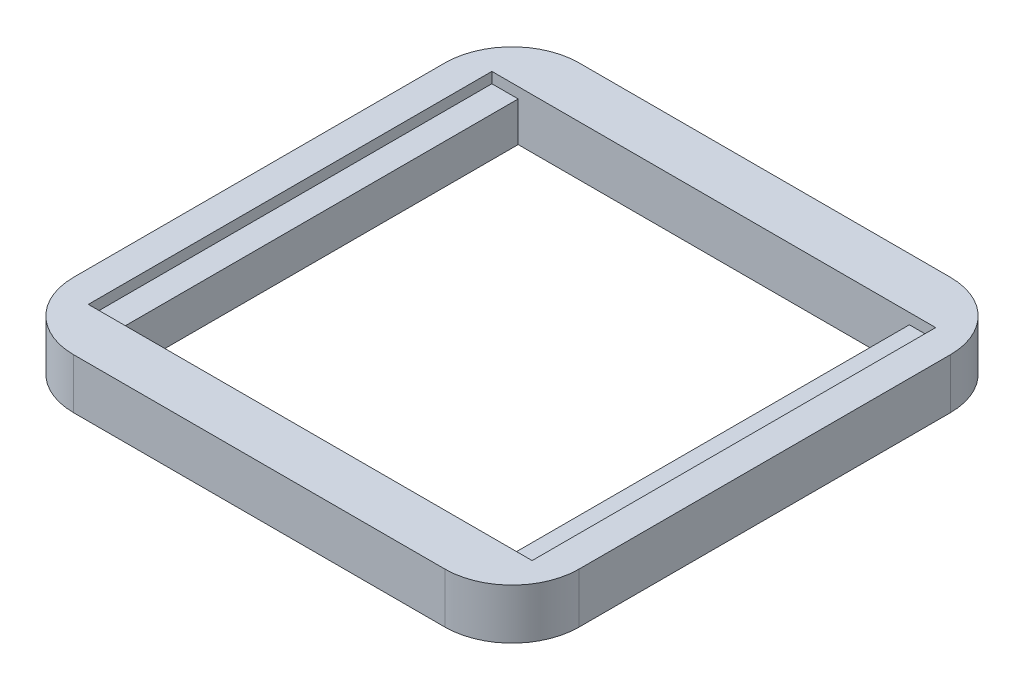
ISO-10303-21;
HEADER;
FILE_DESCRIPTION(('STEP AP214'),'2;1');
FILE_NAME('part.step','',(''),(''),'','','');
FILE_SCHEMA(('AUTOMOTIVE_DESIGN { 1 0 10303 214 1 1 1 1 }'));
ENDSEC;
DATA;
#1=APPLICATION_CONTEXT('core data for automotive mechanical design processes');
#2=APPLICATION_PROTOCOL_DEFINITION('international standard','automotive_design',2000,#1);
#3=PRODUCT_CONTEXT('',#1,'mechanical');
#4=PRODUCT('Part','Part','',(#3));
#5=PRODUCT_RELATED_PRODUCT_CATEGORY('part','',(#4));
#6=PRODUCT_DEFINITION_FORMATION('','',#4);
#7=PRODUCT_DEFINITION_CONTEXT('part definition',#1,'design');
#8=PRODUCT_DEFINITION('design','',#6,#7);
#9=PRODUCT_DEFINITION_SHAPE('','',#8);
#10=(LENGTH_UNIT() NAMED_UNIT(*) SI_UNIT(.MILLI.,.METRE.));
#11=(NAMED_UNIT(*) PLANE_ANGLE_UNIT() SI_UNIT($,.RADIAN.));
#12=(NAMED_UNIT(*) SI_UNIT($,.STERADIAN.) SOLID_ANGLE_UNIT());
#13=UNCERTAINTY_MEASURE_WITH_UNIT(LENGTH_MEASURE(1.E-05),#10,'distance_accuracy_value','');
#14=(GEOMETRIC_REPRESENTATION_CONTEXT(3) GLOBAL_UNCERTAINTY_ASSIGNED_CONTEXT((#13)) GLOBAL_UNIT_ASSIGNED_CONTEXT((#10,
#11,#12)) REPRESENTATION_CONTEXT('',''));
#15=CARTESIAN_POINT('',(0.,0.,0.));
#16=DIRECTION('',(0.,0.,1.));
#17=DIRECTION('',(1.,0.,0.));
#18=AXIS2_PLACEMENT_3D('',#15,#16,#17);
#19=CARTESIAN_POINT('',(0.,5.9,0.));
#20=DIRECTION('',(0.,-1.,0.));
#21=DIRECTION('',(0.,0.,-1.));
#22=AXIS2_PLACEMENT_3D('',#19,#20,#21);
#23=PLANE('',#22);
#24=DIRECTION('',(0.,0.,-1.));
#25=VECTOR('',#24,1.);
#26=CARTESIAN_POINT('',(29.1789436529956,5.9,30.1));
#27=LINE('',#26,#25);
#28=CARTESIAN_POINT('',(29.1789436529956,5.9,30.1));
#29=VERTEX_POINT('',#28);
#30=CARTESIAN_POINT('',(29.1789436529956,5.9,-30.1));
#31=VERTEX_POINT('',#30);
#32=EDGE_CURVE('E178',#29,#31,#27,.T.);
#33=ORIENTED_EDGE('',*,*,#32,.F.);
#34=DIRECTION('',(1.,0.,0.));
#35=VECTOR('',#34,1.);
#36=CARTESIAN_POINT('',(-33.1,5.9,30.1));
#37=LINE('',#36,#35);
#38=CARTESIAN_POINT('',(33.1,5.9,30.1));
#39=VERTEX_POINT('',#38);
#40=EDGE_CURVE('E201',#29,#39,#37,.T.);
#41=ORIENTED_EDGE('',*,*,#40,.T.);
#42=DIRECTION('',(0.,0.,-1.));
#43=VECTOR('',#42,1.);
#44=CARTESIAN_POINT('',(33.1,5.9,30.1));
#45=LINE('',#44,#43);
#46=CARTESIAN_POINT('',(33.1,5.9,-30.1));
#47=VERTEX_POINT('',#46);
#48=EDGE_CURVE('E191',#39,#47,#45,.T.);
#49=ORIENTED_EDGE('',*,*,#48,.T.);
#50=DIRECTION('',(-1.,0.,0.));
#51=VECTOR('',#50,1.);
#52=CARTESIAN_POINT('',(-33.1,5.9,-30.1));
#53=LINE('',#52,#51);
#54=EDGE_CURVE('E195',#47,#31,#53,.T.);
#55=ORIENTED_EDGE('',*,*,#54,.T.);
#56=EDGE_LOOP('',(#33,#41,#49,#55));
#57=FACE_BOUND('',#56,.T.);
#58=ADVANCED_FACE('F39',(#57),#23,.F.);
#59=DIRECTION('',(0.,0.,1.));
#60=VECTOR('',#59,1.);
#61=CARTESIAN_POINT('',(-29.1789436529956,5.9,30.0999999999999));
#62=LINE('',#61,#60);
#63=CARTESIAN_POINT('',(-29.1789436529956,5.9,-30.1));
#64=VERTEX_POINT('',#63);
#65=CARTESIAN_POINT('',(-29.1789436529956,5.9,30.0999999999999));
#66=VERTEX_POINT('',#65);
#67=EDGE_CURVE('E176',#64,#66,#62,.T.);
#68=ORIENTED_EDGE('',*,*,#67,.F.);
#69=CARTESIAN_POINT('',(-33.1,5.9,-30.1));
#70=VERTEX_POINT('',#69);
#71=EDGE_CURVE('E171',#64,#70,#53,.T.);
#72=ORIENTED_EDGE('',*,*,#71,.T.);
#73=DIRECTION('',(0.,0.,1.));
#74=VECTOR('',#73,1.);
#75=CARTESIAN_POINT('',(-33.1,5.9,30.1));
#76=LINE('',#75,#74);
#77=CARTESIAN_POINT('',(-33.1,5.9,30.1));
#78=VERTEX_POINT('',#77);
#79=EDGE_CURVE('E198',#70,#78,#76,.T.);
#80=ORIENTED_EDGE('',*,*,#79,.T.);
#81=EDGE_CURVE('E202',#78,#66,#37,.T.);
#82=ORIENTED_EDGE('',*,*,#81,.T.);
#83=EDGE_LOOP('',(#68,#72,#80,#82));
#84=FACE_BOUND('',#83,.T.);
#85=ADVANCED_FACE('F310',(#84),#23,.F.);
#86=CARTESIAN_POINT('',(37.7,7.5,37.7));
#87=DIRECTION('',(-1.,0.,0.));
#88=DIRECTION('',(0.,0.,1.));
#89=AXIS2_PLACEMENT_3D('',#86,#87,#88);
#90=PLANE('',#89);
#91=DIRECTION('',(0.,0.,-1.));
#92=VECTOR('',#91,1.);
#93=CARTESIAN_POINT('',(37.7,0.,37.7));
#94=LINE('',#93,#92);
#95=CARTESIAN_POINT('',(37.7,0.,27.7));
#96=VERTEX_POINT('',#95);
#97=CARTESIAN_POINT('',(37.7,0.,-27.7));
#98=VERTEX_POINT('',#97);
#99=EDGE_CURVE('E216',#96,#98,#94,.T.);
#100=ORIENTED_EDGE('',*,*,#99,.T.);
#101=DIRECTION('',(0.,-1.,0.));
#102=VECTOR('',#101,1.);
#103=CARTESIAN_POINT('',(37.7,7.5,-27.7));
#104=LINE('',#103,#102);
#105=CARTESIAN_POINT('',(37.7,7.5,-27.7));
#106=VERTEX_POINT('',#105);
#107=EDGE_CURVE('E271',#98,#106,#104,.F.);
#108=ORIENTED_EDGE('',*,*,#107,.T.);
#109=DIRECTION('',(0.,0.,-1.));
#110=VECTOR('',#109,1.);
#111=CARTESIAN_POINT('',(37.7,7.5,37.7));
#112=LINE('',#111,#110);
#113=CARTESIAN_POINT('',(37.7,7.5,27.7));
#114=VERTEX_POINT('',#113);
#115=EDGE_CURVE('E223',#114,#106,#112,.T.);
#116=ORIENTED_EDGE('',*,*,#115,.F.);
#117=DIRECTION('',(0.,-1.,0.));
#118=VECTOR('',#117,1.);
#119=CARTESIAN_POINT('',(37.7,7.5,27.7));
#120=LINE('',#119,#118);
#121=EDGE_CURVE('E268',#114,#96,#120,.T.);
#122=ORIENTED_EDGE('',*,*,#121,.T.);
#123=EDGE_LOOP('',(#100,#108,#116,#122));
#124=FACE_BOUND('',#123,.T.);
#125=ADVANCED_FACE('F285',(#124),#90,.F.);
#126=CARTESIAN_POINT('',(-37.7,7.5,-37.7));
#127=DIRECTION('',(0.,0.,1.));
#128=DIRECTION('',(1.,0.,0.));
#129=AXIS2_PLACEMENT_3D('',#126,#127,#128);
#130=PLANE('',#129);
#131=DIRECTION('',(-1.,0.,0.));
#132=VECTOR('',#131,1.);
#133=CARTESIAN_POINT('',(-37.7,0.,-37.7));
#134=LINE('',#133,#132);
#135=CARTESIAN_POINT('',(27.7,0.,-37.7));
#136=VERTEX_POINT('',#135);
#137=CARTESIAN_POINT('',(-27.7,0.,-37.7));
#138=VERTEX_POINT('',#137);
#139=EDGE_CURVE('E237',#136,#138,#134,.T.);
#140=ORIENTED_EDGE('',*,*,#139,.T.);
#141=DIRECTION('',(0.,-1.,0.));
#142=VECTOR('',#141,1.);
#143=CARTESIAN_POINT('',(-27.7,7.5,-37.7));
#144=LINE('',#143,#142);
#145=CARTESIAN_POINT('',(-27.7,7.5,-37.7));
#146=VERTEX_POINT('',#145);
#147=EDGE_CURVE('E259',#138,#146,#144,.F.);
#148=ORIENTED_EDGE('',*,*,#147,.T.);
#149=DIRECTION('',(-1.,0.,0.));
#150=VECTOR('',#149,1.);
#151=CARTESIAN_POINT('',(-37.7,7.5,-37.7));
#152=LINE('',#151,#150);
#153=CARTESIAN_POINT('',(27.7,7.5,-37.7));
#154=VERTEX_POINT('',#153);
#155=EDGE_CURVE('E226',#154,#146,#152,.T.);
#156=ORIENTED_EDGE('',*,*,#155,.F.);
#157=DIRECTION('',(0.,-1.,0.));
#158=VECTOR('',#157,1.);
#159=CARTESIAN_POINT('',(27.7,7.5,-37.7));
#160=LINE('',#159,#158);
#161=EDGE_CURVE('E256',#154,#136,#160,.T.);
#162=ORIENTED_EDGE('',*,*,#161,.T.);
#163=EDGE_LOOP('',(#140,#148,#156,#162));
#164=FACE_BOUND('',#163,.T.);
#165=ADVANCED_FACE('F295',(#164),#130,.F.);
#166=CARTESIAN_POINT('',(-37.7,7.5,37.7));
#167=DIRECTION('',(1.,0.,0.));
#168=DIRECTION('',(0.,0.,-1.));
#169=AXIS2_PLACEMENT_3D('',#166,#167,#168);
#170=PLANE('',#169);
#171=DIRECTION('',(0.,0.,1.));
#172=VECTOR('',#171,1.);
#173=CARTESIAN_POINT('',(-37.7,7.5,37.7));
#174=LINE('',#173,#172);
#175=CARTESIAN_POINT('',(-37.7,7.5,-27.7));
#176=VERTEX_POINT('',#175);
#177=CARTESIAN_POINT('',(-37.7,7.5,27.7));
#178=VERTEX_POINT('',#177);
#179=EDGE_CURVE('E230',#176,#178,#174,.T.);
#180=ORIENTED_EDGE('',*,*,#179,.F.);
#181=DIRECTION('',(0.,-1.,0.));
#182=VECTOR('',#181,1.);
#183=CARTESIAN_POINT('',(-37.7,7.5,-27.7));
#184=LINE('',#183,#182);
#185=CARTESIAN_POINT('',(-37.7,0.,-27.7));
#186=VERTEX_POINT('',#185);
#187=EDGE_CURVE('E245',#176,#186,#184,.T.);
#188=ORIENTED_EDGE('',*,*,#187,.T.);
#189=DIRECTION('',(0.,0.,1.));
#190=VECTOR('',#189,1.);
#191=CARTESIAN_POINT('',(-37.7,0.,37.7));
#192=LINE('',#191,#190);
#193=CARTESIAN_POINT('',(-37.7,0.,27.7));
#194=VERTEX_POINT('',#193);
#195=EDGE_CURVE('E240',#186,#194,#192,.T.);
#196=ORIENTED_EDGE('',*,*,#195,.T.);
#197=DIRECTION('',(0.,-1.,0.));
#198=VECTOR('',#197,1.);
#199=CARTESIAN_POINT('',(-37.7,7.5,27.7));
#200=LINE('',#199,#198);
#201=EDGE_CURVE('E234',#194,#178,#200,.F.);
#202=ORIENTED_EDGE('',*,*,#201,.T.);
#203=EDGE_LOOP('',(#180,#188,#196,#202));
#204=FACE_BOUND('',#203,.T.);
#205=ADVANCED_FACE('F303',(#204),#170,.F.);
#206=CARTESIAN_POINT('',(-37.7,7.5,37.7));
#207=DIRECTION('',(0.,0.,-1.));
#208=DIRECTION('',(-1.,0.,0.));
#209=AXIS2_PLACEMENT_3D('',#206,#207,#208);
#210=PLANE('',#209);
#211=DIRECTION('',(1.,0.,0.));
#212=VECTOR('',#211,1.);
#213=CARTESIAN_POINT('',(-37.7,0.,37.7));
#214=LINE('',#213,#212);
#215=CARTESIAN_POINT('',(-27.7,0.,37.7));
#216=VERTEX_POINT('',#215);
#217=CARTESIAN_POINT('',(27.7,0.,37.7));
#218=VERTEX_POINT('',#217);
#219=EDGE_CURVE('E227',#216,#218,#214,.T.);
#220=ORIENTED_EDGE('',*,*,#219,.T.);
#221=DIRECTION('',(0.,-1.,0.));
#222=VECTOR('',#221,1.);
#223=CARTESIAN_POINT('',(27.7,7.5,37.7));
#224=LINE('',#223,#222);
#225=CARTESIAN_POINT('',(27.7,7.5,37.7));
#226=VERTEX_POINT('',#225);
#227=EDGE_CURVE('E11',#218,#226,#224,.F.);
#228=ORIENTED_EDGE('',*,*,#227,.T.);
#229=DIRECTION('',(1.,0.,0.));
#230=VECTOR('',#229,1.);
#231=CARTESIAN_POINT('',(-37.7,7.5,37.7));
#232=LINE('',#231,#230);
#233=CARTESIAN_POINT('',(-27.7,7.5,37.7));
#234=VERTEX_POINT('',#233);
#235=EDGE_CURVE('E232',#234,#226,#232,.T.);
#236=ORIENTED_EDGE('',*,*,#235,.F.);
#237=DIRECTION('',(0.,-1.,0.));
#238=VECTOR('',#237,1.);
#239=CARTESIAN_POINT('',(-27.7,7.5,37.7));
#240=LINE('',#239,#238);
#241=EDGE_CURVE('E47',#234,#216,#240,.T.);
#242=ORIENTED_EDGE('',*,*,#241,.T.);
#243=EDGE_LOOP('',(#220,#228,#236,#242));
#244=FACE_BOUND('',#243,.T.);
#245=ADVANCED_FACE('F275',(#244),#210,.F.);
#246=CARTESIAN_POINT('',(0.,7.5,0.));
#247=DIRECTION('',(0.,-1.,0.));
#248=DIRECTION('',(0.,0.,-1.));
#249=AXIS2_PLACEMENT_3D('',#246,#247,#248);
#250=PLANE('',#249);
#251=DIRECTION('',(-1.,0.,0.));
#252=VECTOR('',#251,1.);
#253=CARTESIAN_POINT('',(-33.1,7.5,-30.1));
#254=LINE('',#253,#252);
#255=CARTESIAN_POINT('',(33.1,7.5,-30.1));
#256=VERTEX_POINT('',#255);
#257=CARTESIAN_POINT('',(-33.1,7.5,-30.1));
#258=VERTEX_POINT('',#257);
#259=EDGE_CURVE('E207',#256,#258,#254,.T.);
#260=ORIENTED_EDGE('',*,*,#259,.F.);
#261=DIRECTION('',(0.,0.,-1.));
#262=VECTOR('',#261,1.);
#263=CARTESIAN_POINT('',(33.1,7.5,30.1));
#264=LINE('',#263,#262);
#265=CARTESIAN_POINT('',(33.1,7.5,30.1));
#266=VERTEX_POINT('',#265);
#267=EDGE_CURVE('E190',#266,#256,#264,.T.);
#268=ORIENTED_EDGE('',*,*,#267,.F.);
#269=DIRECTION('',(1.,0.,0.));
#270=VECTOR('',#269,1.);
#271=CARTESIAN_POINT('',(-33.1,7.5,30.1));
#272=LINE('',#271,#270);
#273=CARTESIAN_POINT('',(-33.1,7.5,30.1));
#274=VERTEX_POINT('',#273);
#275=EDGE_CURVE('E194',#274,#266,#272,.T.);
#276=ORIENTED_EDGE('',*,*,#275,.F.);
#277=DIRECTION('',(0.,0.,1.));
#278=VECTOR('',#277,1.);
#279=CARTESIAN_POINT('',(-33.1,7.5,30.1));
#280=LINE('',#279,#278);
#281=EDGE_CURVE('E209',#258,#274,#280,.T.);
#282=ORIENTED_EDGE('',*,*,#281,.F.);
#283=EDGE_LOOP('',(#260,#268,#276,#282));
#284=FACE_BOUND('',#283,.T.);
#285=ORIENTED_EDGE('',*,*,#155,.T.);
#286=CARTESIAN_POINT('',(-27.7,7.5,-27.7));
#287=DIRECTION('',(0.,-1.,0.));
#288=DIRECTION('',(0.,0.,-1.));
#289=AXIS2_PLACEMENT_3D('',#286,#287,#288);
#290=CIRCLE('',#289,10.);
#291=EDGE_CURVE('E266',#146,#176,#290,.F.);
#292=ORIENTED_EDGE('',*,*,#291,.T.);
#293=ORIENTED_EDGE('',*,*,#179,.T.);
#294=CARTESIAN_POINT('',(-27.7,7.5,27.7));
#295=DIRECTION('',(0.,-1.,0.));
#296=DIRECTION('',(0.,0.,-1.));
#297=AXIS2_PLACEMENT_3D('',#294,#295,#296);
#298=CIRCLE('',#297,10.);
#299=EDGE_CURVE('E59',#178,#234,#298,.F.);
#300=ORIENTED_EDGE('',*,*,#299,.T.);
#301=ORIENTED_EDGE('',*,*,#235,.T.);
#302=CARTESIAN_POINT('',(27.7,7.5,27.7));
#303=DIRECTION('',(0.,-1.,0.));
#304=DIRECTION('',(0.,0.,-1.));
#305=AXIS2_PLACEMENT_3D('',#302,#303,#304);
#306=CIRCLE('',#305,10.);
#307=EDGE_CURVE('E262',#226,#114,#306,.F.);
#308=ORIENTED_EDGE('',*,*,#307,.T.);
#309=ORIENTED_EDGE('',*,*,#115,.T.);
#310=CARTESIAN_POINT('',(27.7,7.5,-27.7));
#311=DIRECTION('',(0.,-1.,0.));
#312=DIRECTION('',(0.,0.,-1.));
#313=AXIS2_PLACEMENT_3D('',#310,#311,#312);
#314=CIRCLE('',#313,10.);
#315=EDGE_CURVE('E264',#106,#154,#314,.F.);
#316=ORIENTED_EDGE('',*,*,#315,.T.);
#317=EDGE_LOOP('',(#285,#292,#293,#300,#301,#308,#309,#316));
#318=FACE_BOUND('',#317,.T.);
#319=ADVANCED_FACE('F288',(#284,#318),#250,.F.);
#320=CARTESIAN_POINT('',(0.,0.,0.));
#321=DIRECTION('',(0.,-1.,0.));
#322=DIRECTION('',(0.,0.,-1.));
#323=AXIS2_PLACEMENT_3D('',#320,#321,#322);
#324=PLANE('',#323);
#325=DIRECTION('',(-1.,0.,0.));
#326=VECTOR('',#325,1.);
#327=CARTESIAN_POINT('',(-29.1789436529956,0.,-30.1));
#328=LINE('',#327,#326);
#329=CARTESIAN_POINT('',(29.1789436529956,0.,-30.1));
#330=VERTEX_POINT('',#329);
#331=CARTESIAN_POINT('',(-29.1789436529956,0.,-30.1));
#332=VERTEX_POINT('',#331);
#333=EDGE_CURVE('E168',#330,#332,#328,.T.);
#334=ORIENTED_EDGE('',*,*,#333,.T.);
#335=DIRECTION('',(0.,0.,1.));
#336=VECTOR('',#335,1.);
#337=CARTESIAN_POINT('',(-29.1789436529956,0.,30.0999999999999));
#338=LINE('',#337,#336);
#339=CARTESIAN_POINT('',(-29.1789436529956,0.,30.0999999999999));
#340=VERTEX_POINT('',#339);
#341=EDGE_CURVE('E152',#332,#340,#338,.T.);
#342=ORIENTED_EDGE('',*,*,#341,.T.);
#343=DIRECTION('',(1.,0.,0.));
#344=VECTOR('',#343,1.);
#345=CARTESIAN_POINT('',(-29.1789436529956,0.,30.0999999999999));
#346=LINE('',#345,#344);
#347=CARTESIAN_POINT('',(29.1789436529956,0.,30.1));
#348=VERTEX_POINT('',#347);
#349=EDGE_CURVE('E185',#340,#348,#346,.T.);
#350=ORIENTED_EDGE('',*,*,#349,.T.);
#351=DIRECTION('',(0.,0.,-1.));
#352=VECTOR('',#351,1.);
#353=CARTESIAN_POINT('',(29.1789436529956,0.,30.1));
#354=LINE('',#353,#352);
#355=EDGE_CURVE('E175',#348,#330,#354,.T.);
#356=ORIENTED_EDGE('',*,*,#355,.T.);
#357=EDGE_LOOP('',(#334,#342,#350,#356));
#358=FACE_BOUND('',#357,.T.);
#359=ORIENTED_EDGE('',*,*,#195,.F.);
#360=CARTESIAN_POINT('',(-27.7,0.,-27.7));
#361=DIRECTION('',(0.,-1.,0.));
#362=DIRECTION('',(0.,0.,-1.));
#363=AXIS2_PLACEMENT_3D('',#360,#361,#362);
#364=CIRCLE('',#363,10.);
#365=EDGE_CURVE('E254',#186,#138,#364,.T.);
#366=ORIENTED_EDGE('',*,*,#365,.T.);
#367=ORIENTED_EDGE('',*,*,#139,.F.);
#368=CARTESIAN_POINT('',(27.7,0.,-27.7));
#369=DIRECTION('',(0.,-1.,0.));
#370=DIRECTION('',(0.,0.,-1.));
#371=AXIS2_PLACEMENT_3D('',#368,#369,#370);
#372=CIRCLE('',#371,10.);
#373=EDGE_CURVE('E252',#136,#98,#372,.T.);
#374=ORIENTED_EDGE('',*,*,#373,.T.);
#375=ORIENTED_EDGE('',*,*,#99,.F.);
#376=CARTESIAN_POINT('',(27.7,0.,27.7));
#377=DIRECTION('',(0.,-1.,0.));
#378=DIRECTION('',(0.,0.,-1.));
#379=AXIS2_PLACEMENT_3D('',#376,#377,#378);
#380=CIRCLE('',#379,10.);
#381=EDGE_CURVE('E250',#96,#218,#380,.T.);
#382=ORIENTED_EDGE('',*,*,#381,.T.);
#383=ORIENTED_EDGE('',*,*,#219,.F.);
#384=CARTESIAN_POINT('',(-27.7,0.,27.7));
#385=DIRECTION('',(0.,-1.,0.));
#386=DIRECTION('',(0.,0.,-1.));
#387=AXIS2_PLACEMENT_3D('',#384,#385,#386);
#388=CIRCLE('',#387,10.);
#389=EDGE_CURVE('E248',#216,#194,#388,.T.);
#390=ORIENTED_EDGE('',*,*,#389,.T.);
#391=EDGE_LOOP('',(#359,#366,#367,#374,#375,#382,#383,#390));
#392=FACE_BOUND('',#391,.T.);
#393=ADVANCED_FACE('F173',(#358,#392),#324,.T.);
#394=CARTESIAN_POINT('',(33.1,5.9,30.1));
#395=DIRECTION('',(1.,0.,0.));
#396=DIRECTION('',(0.,0.,-1.));
#397=AXIS2_PLACEMENT_3D('',#394,#395,#396);
#398=PLANE('',#397);
#399=ORIENTED_EDGE('',*,*,#267,.T.);
#400=DIRECTION('',(0.,1.,0.));
#401=VECTOR('',#400,1.);
#402=CARTESIAN_POINT('',(33.1,5.9,-30.1));
#403=LINE('',#402,#401);
#404=EDGE_CURVE('E205',#47,#256,#403,.T.);
#405=ORIENTED_EDGE('',*,*,#404,.F.);
#406=ORIENTED_EDGE('',*,*,#48,.F.);
#407=DIRECTION('',(0.,1.,0.));
#408=VECTOR('',#407,1.);
#409=CARTESIAN_POINT('',(33.1,5.9,30.1));
#410=LINE('',#409,#408);
#411=EDGE_CURVE('E214',#39,#266,#410,.T.);
#412=ORIENTED_EDGE('',*,*,#411,.T.);
#413=EDGE_LOOP('',(#399,#405,#406,#412));
#414=FACE_BOUND('',#413,.T.);
#415=ADVANCED_FACE('F326',(#414),#398,.F.);
#416=CARTESIAN_POINT('',(-33.1,5.9,30.1));
#417=DIRECTION('',(0.,0.,1.));
#418=DIRECTION('',(1.,0.,0.));
#419=AXIS2_PLACEMENT_3D('',#416,#417,#418);
#420=PLANE('',#419);
#421=ORIENTED_EDGE('',*,*,#275,.T.);
#422=ORIENTED_EDGE('',*,*,#411,.F.);
#423=ORIENTED_EDGE('',*,*,#40,.F.);
#424=DIRECTION('',(0.,1.,0.));
#425=VECTOR('',#424,1.);
#426=CARTESIAN_POINT('',(29.1789436529956,-83.8432049173859,30.1));
#427=LINE('',#426,#425);
#428=EDGE_CURVE('E184',#348,#29,#427,.T.);
#429=ORIENTED_EDGE('',*,*,#428,.F.);
#430=ORIENTED_EDGE('',*,*,#349,.F.);
#431=DIRECTION('',(0.,1.,0.));
#432=VECTOR('',#431,1.);
#433=CARTESIAN_POINT('',(-29.1789436529956,-83.8432049173859,30.0999999999999));
#434=LINE('',#433,#432);
#435=EDGE_CURVE('E158',#340,#66,#434,.T.);
#436=ORIENTED_EDGE('',*,*,#435,.T.);
#437=ORIENTED_EDGE('',*,*,#81,.F.);
#438=DIRECTION('',(0.,1.,0.));
#439=VECTOR('',#438,1.);
#440=CARTESIAN_POINT('',(-33.1,5.9,30.1));
#441=LINE('',#440,#439);
#442=EDGE_CURVE('E217',#78,#274,#441,.T.);
#443=ORIENTED_EDGE('',*,*,#442,.T.);
#444=EDGE_LOOP('',(#421,#422,#423,#429,#430,#436,#437,#443));
#445=FACE_BOUND('',#444,.T.);
#446=ADVANCED_FACE('F322',(#445),#420,.F.);
#447=CARTESIAN_POINT('',(-33.1,5.9,30.1));
#448=DIRECTION('',(-1.,0.,0.));
#449=DIRECTION('',(0.,0.,1.));
#450=AXIS2_PLACEMENT_3D('',#447,#448,#449);
#451=PLANE('',#450);
#452=ORIENTED_EDGE('',*,*,#281,.T.);
#453=ORIENTED_EDGE('',*,*,#442,.F.);
#454=ORIENTED_EDGE('',*,*,#79,.F.);
#455=DIRECTION('',(0.,1.,0.));
#456=VECTOR('',#455,1.);
#457=CARTESIAN_POINT('',(-33.1,5.9,-30.1));
#458=LINE('',#457,#456);
#459=EDGE_CURVE('E219',#70,#258,#458,.T.);
#460=ORIENTED_EDGE('',*,*,#459,.T.);
#461=EDGE_LOOP('',(#452,#453,#454,#460));
#462=FACE_BOUND('',#461,.T.);
#463=ADVANCED_FACE('F325',(#462),#451,.F.);
#464=CARTESIAN_POINT('',(-33.1,5.9,-30.1));
#465=DIRECTION('',(0.,0.,-1.));
#466=DIRECTION('',(-1.,0.,0.));
#467=AXIS2_PLACEMENT_3D('',#464,#465,#466);
#468=PLANE('',#467);
#469=ORIENTED_EDGE('',*,*,#259,.T.);
#470=ORIENTED_EDGE('',*,*,#459,.F.);
#471=ORIENTED_EDGE('',*,*,#71,.F.);
#472=DIRECTION('',(0.,1.,0.));
#473=VECTOR('',#472,1.);
#474=CARTESIAN_POINT('',(-29.1789436529956,-83.8432049173859,-30.1));
#475=LINE('',#474,#473);
#476=EDGE_CURVE('E156',#332,#64,#475,.T.);
#477=ORIENTED_EDGE('',*,*,#476,.F.);
#478=ORIENTED_EDGE('',*,*,#333,.F.);
#479=DIRECTION('',(0.,1.,0.));
#480=VECTOR('',#479,1.);
#481=CARTESIAN_POINT('',(29.1789436529956,-83.8432049173859,-30.1));
#482=LINE('',#481,#480);
#483=EDGE_CURVE('E183',#330,#31,#482,.T.);
#484=ORIENTED_EDGE('',*,*,#483,.T.);
#485=ORIENTED_EDGE('',*,*,#54,.F.);
#486=ORIENTED_EDGE('',*,*,#404,.T.);
#487=EDGE_LOOP('',(#469,#470,#471,#477,#478,#484,#485,#486));
#488=FACE_BOUND('',#487,.T.);
#489=ADVANCED_FACE('F167',(#488),#468,.F.);
#490=CARTESIAN_POINT('',(-29.1789436529956,-83.8432049173859,30.0999999999999));
#491=DIRECTION('',(-1.,0.,0.));
#492=DIRECTION('',(0.,0.,1.));
#493=AXIS2_PLACEMENT_3D('',#490,#491,#492);
#494=PLANE('',#493);
#495=ORIENTED_EDGE('',*,*,#476,.T.);
#496=ORIENTED_EDGE('',*,*,#67,.T.);
#497=ORIENTED_EDGE('',*,*,#435,.F.);
#498=ORIENTED_EDGE('',*,*,#341,.F.);
#499=EDGE_LOOP('',(#495,#496,#497,#498));
#500=FACE_BOUND('',#499,.T.);
#501=ADVANCED_FACE('F154',(#500),#494,.F.);
#502=CARTESIAN_POINT('',(29.1789436529956,-83.8432049173859,30.1));
#503=DIRECTION('',(1.,0.,0.));
#504=DIRECTION('',(0.,0.,-1.));
#505=AXIS2_PLACEMENT_3D('',#502,#503,#504);
#506=PLANE('',#505);
#507=ORIENTED_EDGE('',*,*,#428,.T.);
#508=ORIENTED_EDGE('',*,*,#32,.T.);
#509=ORIENTED_EDGE('',*,*,#483,.F.);
#510=ORIENTED_EDGE('',*,*,#355,.F.);
#511=EDGE_LOOP('',(#507,#508,#509,#510));
#512=FACE_BOUND('',#511,.T.);
#513=ADVANCED_FACE('F350',(#512),#506,.F.);
#514=CARTESIAN_POINT('',(-27.7,7.5,-27.7));
#515=DIRECTION('',(0.,-1.,0.));
#516=DIRECTION('',(0.,0.,-1.));
#517=AXIS2_PLACEMENT_3D('',#514,#515,#516);
#518=CYLINDRICAL_SURFACE('',#517,10.);
#519=ORIENTED_EDGE('',*,*,#291,.F.);
#520=ORIENTED_EDGE('',*,*,#147,.F.);
#521=ORIENTED_EDGE('',*,*,#365,.F.);
#522=ORIENTED_EDGE('',*,*,#187,.F.);
#523=EDGE_LOOP('',(#519,#520,#521,#522));
#524=FACE_BOUND('',#523,.T.);
#525=ADVANCED_FACE('F300',(#524),#518,.T.);
#526=CARTESIAN_POINT('',(27.7,7.5,-27.7));
#527=DIRECTION('',(0.,-1.,0.));
#528=DIRECTION('',(0.,0.,-1.));
#529=AXIS2_PLACEMENT_3D('',#526,#527,#528);
#530=CYLINDRICAL_SURFACE('',#529,10.);
#531=ORIENTED_EDGE('',*,*,#315,.F.);
#532=ORIENTED_EDGE('',*,*,#107,.F.);
#533=ORIENTED_EDGE('',*,*,#373,.F.);
#534=ORIENTED_EDGE('',*,*,#161,.F.);
#535=EDGE_LOOP('',(#531,#532,#533,#534));
#536=FACE_BOUND('',#535,.T.);
#537=ADVANCED_FACE('F292',(#536),#530,.T.);
#538=CARTESIAN_POINT('',(27.7,7.5,27.7));
#539=DIRECTION('',(0.,-1.,0.));
#540=DIRECTION('',(0.,0.,-1.));
#541=AXIS2_PLACEMENT_3D('',#538,#539,#540);
#542=CYLINDRICAL_SURFACE('',#541,10.);
#543=ORIENTED_EDGE('',*,*,#307,.F.);
#544=ORIENTED_EDGE('',*,*,#227,.F.);
#545=ORIENTED_EDGE('',*,*,#381,.F.);
#546=ORIENTED_EDGE('',*,*,#121,.F.);
#547=EDGE_LOOP('',(#543,#544,#545,#546));
#548=FACE_BOUND('',#547,.T.);
#549=ADVANCED_FACE('F282',(#548),#542,.T.);
#550=CARTESIAN_POINT('',(-27.7,7.5,27.7));
#551=DIRECTION('',(0.,-1.,0.));
#552=DIRECTION('',(0.,0.,-1.));
#553=AXIS2_PLACEMENT_3D('',#550,#551,#552);
#554=CYLINDRICAL_SURFACE('',#553,10.);
#555=ORIENTED_EDGE('',*,*,#299,.F.);
#556=ORIENTED_EDGE('',*,*,#201,.F.);
#557=ORIENTED_EDGE('',*,*,#389,.F.);
#558=ORIENTED_EDGE('',*,*,#241,.F.);
#559=EDGE_LOOP('',(#555,#556,#557,#558));
#560=FACE_BOUND('',#559,.T.);
#561=ADVANCED_FACE('F41',(#560),#554,.T.);
#562=CLOSED_SHELL('',(#58,#85,#125,#165,#205,#245,#319,#393,#415,#446,#463,#489,#501,#513,#525,
#537,#549,#561));
#563=MANIFOLD_SOLID_BREP('B2',#562);
#564=ADVANCED_BREP_SHAPE_REPRESENTATION('',(#18,#563),#14);
#565=SHAPE_DEFINITION_REPRESENTATION(#9,#564);
ENDSEC;
END-ISO-10303-21;
